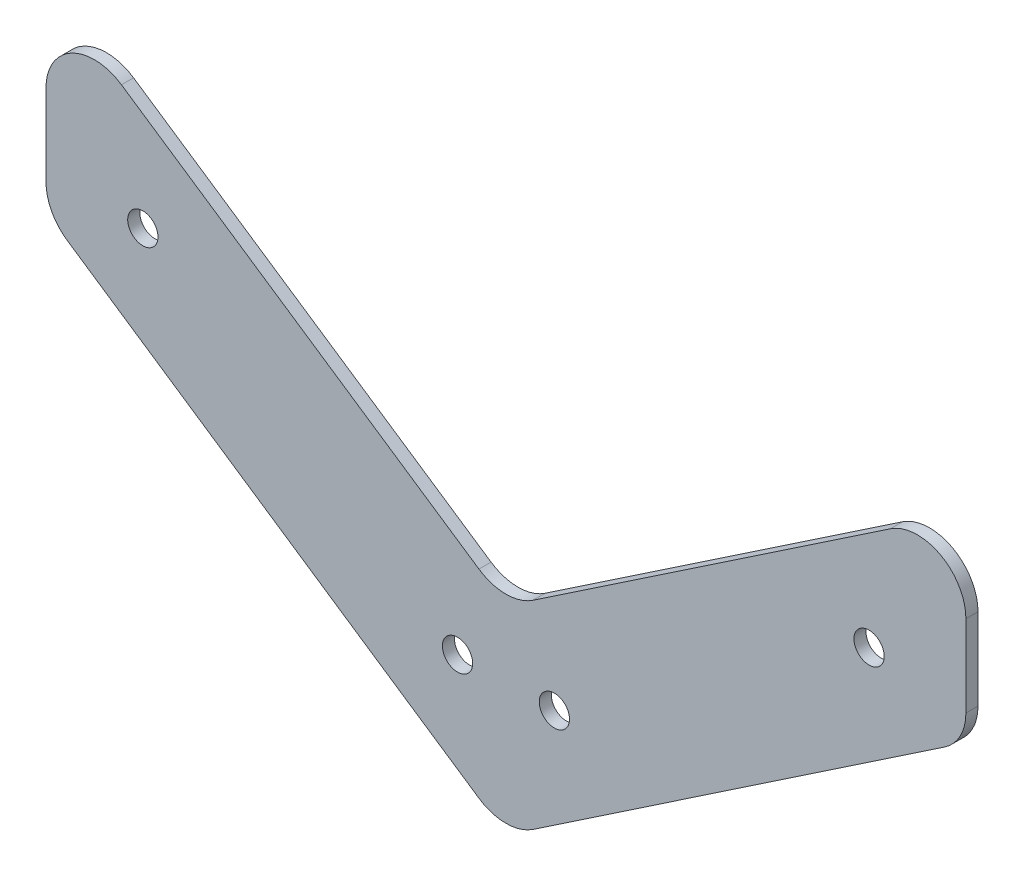
ISO-10303-21;
HEADER;
FILE_DESCRIPTION(('STEP AP214'),'2;1');
FILE_NAME('part.step','',(''),(''),'','','');
FILE_SCHEMA(('AUTOMOTIVE_DESIGN { 1 0 10303 214 1 1 1 1 }'));
ENDSEC;
DATA;
#1=APPLICATION_CONTEXT('core data for automotive mechanical design processes');
#2=APPLICATION_PROTOCOL_DEFINITION('international standard','automotive_design',2000,#1);
#3=PRODUCT_CONTEXT('',#1,'mechanical');
#4=PRODUCT('Part','Part','',(#3));
#5=PRODUCT_RELATED_PRODUCT_CATEGORY('part','',(#4));
#6=PRODUCT_DEFINITION_FORMATION('','',#4);
#7=PRODUCT_DEFINITION_CONTEXT('part definition',#1,'design');
#8=PRODUCT_DEFINITION('design','',#6,#7);
#9=PRODUCT_DEFINITION_SHAPE('','',#8);
#10=(LENGTH_UNIT() NAMED_UNIT(*) SI_UNIT(.MILLI.,.METRE.));
#11=(NAMED_UNIT(*) PLANE_ANGLE_UNIT() SI_UNIT($,.RADIAN.));
#12=(NAMED_UNIT(*) SI_UNIT($,.STERADIAN.) SOLID_ANGLE_UNIT());
#13=UNCERTAINTY_MEASURE_WITH_UNIT(LENGTH_MEASURE(1.E-05),#10,'distance_accuracy_value','');
#14=(GEOMETRIC_REPRESENTATION_CONTEXT(3) GLOBAL_UNCERTAINTY_ASSIGNED_CONTEXT((#13)) GLOBAL_UNIT_ASSIGNED_CONTEXT((#10,
#11,#12)) REPRESENTATION_CONTEXT('',''));
#15=CARTESIAN_POINT('',(0.,0.,0.));
#16=DIRECTION('',(0.,0.,1.));
#17=DIRECTION('',(1.,0.,0.));
#18=AXIS2_PLACEMENT_3D('',#15,#16,#17);
#19=CARTESIAN_POINT('',(0.,0.,3.175));
#20=DIRECTION('',(0.,0.,1.));
#21=DIRECTION('',(1.,0.,0.));
#22=AXIS2_PLACEMENT_3D('',#19,#20,#21);
#23=PLANE('',#22);
#24=CARTESIAN_POINT('',(-12.7,-17.4767862240514,3.175));
#25=DIRECTION('',(0.,0.,1.));
#26=DIRECTION('',(1.,0.,0.));
#27=AXIS2_PLACEMENT_3D('',#24,#25,#26);
#28=CIRCLE('',#27,3.96875);
#29=CARTESIAN_POINT('',(-8.73125,-17.4767862240514,3.175));
#30=VERTEX_POINT('',#29);
#31=EDGE_CURVE('E440',#30,#30,#28,.T.);
#32=ORIENTED_EDGE('',*,*,#31,.F.);
#33=EDGE_LOOP('',(#32));
#34=FACE_BOUND('',#33,.T.);
#35=CARTESIAN_POINT('',(-95.25,38.1,3.175));
#36=DIRECTION('',(0.,0.,1.));
#37=DIRECTION('',(1.,0.,0.));
#38=AXIS2_PLACEMENT_3D('',#35,#36,#37);
#39=CIRCLE('',#38,3.96874999999999);
#40=CARTESIAN_POINT('',(-91.28125,38.1,3.175));
#41=VERTEX_POINT('',#40);
#42=EDGE_CURVE('E230',#41,#41,#39,.T.);
#43=ORIENTED_EDGE('',*,*,#42,.F.);
#44=EDGE_LOOP('',(#43));
#45=FACE_BOUND('',#44,.T.);
#46=DIRECTION('',(0.829521242409178,-0.558475163630338,0.));
#47=VECTOR('',#46,1.);
#48=CARTESIAN_POINT('',(0.,-52.0541220555032,3.175));
#49=LINE('',#48,#47);
#50=CARTESIAN_POINT('',(-115.042634578105,25.3983298960295,3.175));
#51=VERTEX_POINT('',#50);
#52=CARTESIAN_POINT('',(-7.0926345781053,-47.2790059354223,3.175));
#53=VERTEX_POINT('',#52);
#54=EDGE_CURVE('E246',#51,#53,#49,.T.);
#55=ORIENTED_EDGE('',*,*,#54,.T.);
#56=CARTESIAN_POINT('',(0.,-36.7440861568258,3.175));
#57=DIRECTION('',(0.,0.,1.));
#58=DIRECTION('',(1.,0.,0.));
#59=AXIS2_PLACEMENT_3D('',#56,#57,#58);
#60=CIRCLE('',#59,12.7);
#61=CARTESIAN_POINT('',(7.09263457810531,-47.2790059354223,3.175));
#62=VERTEX_POINT('',#61);
#63=EDGE_CURVE('E192',#53,#62,#60,.T.);
#64=ORIENTED_EDGE('',*,*,#63,.T.);
#65=DIRECTION('',(0.829521242409178,0.558475163630338,0.));
#66=VECTOR('',#65,1.);
#67=CARTESIAN_POINT('',(120.65,29.1734885796488,3.175));
#68=LINE('',#67,#66);
#69=CARTESIAN_POINT('',(115.042634578105,25.3983298960294,3.175));
#70=VERTEX_POINT('',#69);
#71=EDGE_CURVE('E151',#62,#70,#68,.T.);
#72=ORIENTED_EDGE('',*,*,#71,.T.);
#73=CARTESIAN_POINT('',(107.95,35.933249674626,3.175));
#74=DIRECTION('',(0.,0.,1.));
#75=DIRECTION('',(1.,0.,0.));
#76=AXIS2_PLACEMENT_3D('',#73,#74,#75);
#77=CIRCLE('',#76,12.7);
#78=CARTESIAN_POINT('',(120.65,35.933249674626,3.175));
#79=VERTEX_POINT('',#78);
#80=EDGE_CURVE('E62',#70,#79,#77,.T.);
#81=ORIENTED_EDGE('',*,*,#80,.T.);
#82=DIRECTION('',(0.,1.,0.));
#83=VECTOR('',#82,1.);
#84=CARTESIAN_POINT('',(120.65,81.227610635152,3.175));
#85=LINE('',#84,#83);
#86=CARTESIAN_POINT('',(120.65,57.3672999327744,3.175));
#87=VERTEX_POINT('',#86);
#88=EDGE_CURVE('E170',#79,#87,#85,.T.);
#89=ORIENTED_EDGE('',*,*,#88,.T.);
#90=CARTESIAN_POINT('',(107.95,57.3672999327744,3.175));
#91=DIRECTION('',(0.,0.,1.));
#92=DIRECTION('',(1.,0.,0.));
#93=AXIS2_PLACEMENT_3D('',#90,#91,#92);
#94=CIRCLE('',#93,12.7);
#95=CARTESIAN_POINT('',(100.857365421895,67.9022197113709,3.175));
#96=VERTEX_POINT('',#95);
#97=EDGE_CURVE('E187',#87,#96,#94,.T.);
#98=ORIENTED_EDGE('',*,*,#97,.T.);
#99=DIRECTION('',(-0.829521242409178,-0.558475163630338,0.));
#100=VECTOR('',#99,1.);
#101=CARTESIAN_POINT('',(0.,0.,3.175));
#102=LINE('',#101,#100);
#103=CARTESIAN_POINT('',(7.09263457810529,4.77511612008083,3.175));
#104=VERTEX_POINT('',#103);
#105=EDGE_CURVE('E164',#96,#104,#102,.T.);
#106=ORIENTED_EDGE('',*,*,#105,.T.);
#107=CARTESIAN_POINT('',(0.,15.3100358986774,3.175));
#108=DIRECTION('',(0.,0.,1.));
#109=DIRECTION('',(1.,0.,0.));
#110=AXIS2_PLACEMENT_3D('',#107,#108,#109);
#111=CIRCLE('',#110,12.7);
#112=CARTESIAN_POINT('',(-7.09263457810529,4.77511612008083,3.175));
#113=VERTEX_POINT('',#112);
#114=EDGE_CURVE('E11',#104,#113,#111,.F.);
#115=ORIENTED_EDGE('',*,*,#114,.T.);
#116=DIRECTION('',(-0.829521242409178,0.558475163630338,0.));
#117=VECTOR('',#116,1.);
#118=CARTESIAN_POINT('',(0.,0.,3.175));
#119=LINE('',#118,#117);
#120=CARTESIAN_POINT('',(-100.857365421895,67.9022197113709,3.175));
#121=VERTEX_POINT('',#120);
#122=EDGE_CURVE('E238',#113,#121,#119,.T.);
#123=ORIENTED_EDGE('',*,*,#122,.T.);
#124=CARTESIAN_POINT('',(-107.95,57.3672999327744,3.175));
#125=DIRECTION('',(0.,0.,1.));
#126=DIRECTION('',(1.,0.,0.));
#127=AXIS2_PLACEMENT_3D('',#124,#125,#126);
#128=CIRCLE('',#127,12.7);
#129=CARTESIAN_POINT('',(-120.65,57.3672999327744,3.175));
#130=VERTEX_POINT('',#129);
#131=EDGE_CURVE('E183',#121,#130,#128,.T.);
#132=ORIENTED_EDGE('',*,*,#131,.T.);
#133=DIRECTION('',(0.,-1.,0.));
#134=VECTOR('',#133,1.);
#135=CARTESIAN_POINT('',(-120.65,29.1734885796488,3.175));
#136=LINE('',#135,#134);
#137=CARTESIAN_POINT('',(-120.65,35.933249674626,3.175));
#138=VERTEX_POINT('',#137);
#139=EDGE_CURVE('E243',#130,#138,#136,.T.);
#140=ORIENTED_EDGE('',*,*,#139,.T.);
#141=CARTESIAN_POINT('',(-107.95,35.933249674626,3.175));
#142=DIRECTION('',(0.,0.,1.));
#143=DIRECTION('',(1.,0.,0.));
#144=AXIS2_PLACEMENT_3D('',#141,#142,#143);
#145=CIRCLE('',#144,12.7);
#146=EDGE_CURVE('E185',#138,#51,#145,.T.);
#147=ORIENTED_EDGE('',*,*,#146,.T.);
#148=EDGE_LOOP('',(#55,#64,#72,#81,#89,#98,#106,#115,#123,#132,#140,#147));
#149=FACE_BOUND('',#148,.T.);
#150=CARTESIAN_POINT('',(95.25,38.1,3.175));
#151=DIRECTION('',(0.,0.,1.));
#152=DIRECTION('',(1.,0.,0.));
#153=AXIS2_PLACEMENT_3D('',#150,#151,#152);
#154=CIRCLE('',#153,3.96874999999999);
#155=CARTESIAN_POINT('',(99.21875,38.1,3.175));
#156=VERTEX_POINT('',#155);
#157=EDGE_CURVE('E434',#156,#156,#154,.T.);
#158=ORIENTED_EDGE('',*,*,#157,.F.);
#159=EDGE_LOOP('',(#158));
#160=FACE_BOUND('',#159,.T.);
#161=CARTESIAN_POINT('',(12.7,-17.4767862240514,3.175));
#162=DIRECTION('',(0.,0.,1.));
#163=DIRECTION('',(1.,0.,0.));
#164=AXIS2_PLACEMENT_3D('',#161,#162,#163);
#165=CIRCLE('',#164,3.96875);
#166=CARTESIAN_POINT('',(16.66875,-17.4767862240514,3.175));
#167=VERTEX_POINT('',#166);
#168=EDGE_CURVE('E462',#167,#167,#165,.T.);
#169=ORIENTED_EDGE('',*,*,#168,.F.);
#170=EDGE_LOOP('',(#169));
#171=FACE_BOUND('',#170,.T.);
#172=ADVANCED_FACE('F36',(#34,#45,#149,#160,#171),#23,.T.);
#173=CARTESIAN_POINT('',(0.,0.,0.));
#174=DIRECTION('',(0.,0.,1.));
#175=DIRECTION('',(1.,0.,0.));
#176=AXIS2_PLACEMENT_3D('',#173,#174,#175);
#177=PLANE('',#176);
#178=DIRECTION('',(0.829521242409178,0.558475163630338,0.));
#179=VECTOR('',#178,1.);
#180=CARTESIAN_POINT('',(120.65,29.1734885796488,0.));
#181=LINE('',#180,#179);
#182=CARTESIAN_POINT('',(7.09263457810531,-47.2790059354223,0.));
#183=VERTEX_POINT('',#182);
#184=CARTESIAN_POINT('',(115.042634578105,25.3983298960294,0.));
#185=VERTEX_POINT('',#184);
#186=EDGE_CURVE('E149',#183,#185,#181,.T.);
#187=ORIENTED_EDGE('',*,*,#186,.F.);
#188=CARTESIAN_POINT('',(0.,-36.7440861568258,0.));
#189=DIRECTION('',(0.,0.,1.));
#190=DIRECTION('',(1.,0.,0.));
#191=AXIS2_PLACEMENT_3D('',#188,#189,#190);
#192=CIRCLE('',#191,12.7);
#193=CARTESIAN_POINT('',(-7.0926345781053,-47.2790059354223,0.));
#194=VERTEX_POINT('',#193);
#195=EDGE_CURVE('E132',#183,#194,#192,.F.);
#196=ORIENTED_EDGE('',*,*,#195,.T.);
#197=DIRECTION('',(0.829521242409178,-0.558475163630338,0.));
#198=VECTOR('',#197,1.);
#199=CARTESIAN_POINT('',(0.,-52.0541220555032,0.));
#200=LINE('',#199,#198);
#201=CARTESIAN_POINT('',(-115.042634578105,25.3983298960295,0.));
#202=VERTEX_POINT('',#201);
#203=EDGE_CURVE('E160',#202,#194,#200,.T.);
#204=ORIENTED_EDGE('',*,*,#203,.F.);
#205=CARTESIAN_POINT('',(-107.95,35.933249674626,0.));
#206=DIRECTION('',(0.,0.,1.));
#207=DIRECTION('',(1.,0.,0.));
#208=AXIS2_PLACEMENT_3D('',#205,#206,#207);
#209=CIRCLE('',#208,12.7);
#210=CARTESIAN_POINT('',(-120.65,35.933249674626,0.));
#211=VERTEX_POINT('',#210);
#212=EDGE_CURVE('E173',#202,#211,#209,.F.);
#213=ORIENTED_EDGE('',*,*,#212,.T.);
#214=DIRECTION('',(0.,-1.,0.));
#215=VECTOR('',#214,1.);
#216=CARTESIAN_POINT('',(-120.65,29.1734885796488,0.));
#217=LINE('',#216,#215);
#218=CARTESIAN_POINT('',(-120.65,57.3672999327744,0.));
#219=VERTEX_POINT('',#218);
#220=EDGE_CURVE('E166',#219,#211,#217,.T.);
#221=ORIENTED_EDGE('',*,*,#220,.F.);
#222=CARTESIAN_POINT('',(-107.95,57.3672999327744,0.));
#223=DIRECTION('',(0.,0.,1.));
#224=DIRECTION('',(1.,0.,0.));
#225=AXIS2_PLACEMENT_3D('',#222,#223,#224);
#226=CIRCLE('',#225,12.7);
#227=CARTESIAN_POINT('',(-100.857365421895,67.9022197113709,0.));
#228=VERTEX_POINT('',#227);
#229=EDGE_CURVE('E152',#219,#228,#226,.F.);
#230=ORIENTED_EDGE('',*,*,#229,.T.);
#231=DIRECTION('',(-0.829521242409178,0.558475163630338,0.));
#232=VECTOR('',#231,1.);
#233=CARTESIAN_POINT('',(0.,0.,0.));
#234=LINE('',#233,#232);
#235=CARTESIAN_POINT('',(-7.09263457810529,4.77511612008083,0.));
#236=VERTEX_POINT('',#235);
#237=EDGE_CURVE('E220',#236,#228,#234,.T.);
#238=ORIENTED_EDGE('',*,*,#237,.F.);
#239=CARTESIAN_POINT('',(0.,15.3100358986774,0.));
#240=DIRECTION('',(0.,0.,1.));
#241=DIRECTION('',(1.,0.,0.));
#242=AXIS2_PLACEMENT_3D('',#239,#240,#241);
#243=CIRCLE('',#242,12.7);
#244=CARTESIAN_POINT('',(7.09263457810529,4.77511612008083,0.));
#245=VERTEX_POINT('',#244);
#246=EDGE_CURVE('E44',#236,#245,#243,.T.);
#247=ORIENTED_EDGE('',*,*,#246,.T.);
#248=DIRECTION('',(-0.829521242409178,-0.558475163630338,0.));
#249=VECTOR('',#248,1.);
#250=CARTESIAN_POINT('',(0.,0.,0.));
#251=LINE('',#250,#249);
#252=CARTESIAN_POINT('',(100.857365421895,67.9022197113709,0.));
#253=VERTEX_POINT('',#252);
#254=EDGE_CURVE('E218',#253,#245,#251,.T.);
#255=ORIENTED_EDGE('',*,*,#254,.F.);
#256=CARTESIAN_POINT('',(107.95,57.3672999327744,0.));
#257=DIRECTION('',(0.,0.,1.));
#258=DIRECTION('',(1.,0.,0.));
#259=AXIS2_PLACEMENT_3D('',#256,#257,#258);
#260=CIRCLE('',#259,12.7);
#261=CARTESIAN_POINT('',(120.65,57.3672999327744,0.));
#262=VERTEX_POINT('',#261);
#263=EDGE_CURVE('E175',#253,#262,#260,.F.);
#264=ORIENTED_EDGE('',*,*,#263,.T.);
#265=DIRECTION('',(0.,1.,0.));
#266=VECTOR('',#265,1.);
#267=CARTESIAN_POINT('',(120.65,81.227610635152,0.));
#268=LINE('',#267,#266);
#269=CARTESIAN_POINT('',(120.65,35.933249674626,0.));
#270=VERTEX_POINT('',#269);
#271=EDGE_CURVE('E159',#270,#262,#268,.T.);
#272=ORIENTED_EDGE('',*,*,#271,.F.);
#273=CARTESIAN_POINT('',(107.95,35.933249674626,0.));
#274=DIRECTION('',(0.,0.,1.));
#275=DIRECTION('',(1.,0.,0.));
#276=AXIS2_PLACEMENT_3D('',#273,#274,#275);
#277=CIRCLE('',#276,12.7);
#278=EDGE_CURVE('E143',#270,#185,#277,.F.);
#279=ORIENTED_EDGE('',*,*,#278,.T.);
#280=EDGE_LOOP('',(#187,#196,#204,#213,#221,#230,#238,#247,#255,#264,#272,#279));
#281=FACE_BOUND('',#280,.T.);
#282=CARTESIAN_POINT('',(-95.25,38.1,0.));
#283=DIRECTION('',(0.,0.,1.));
#284=DIRECTION('',(1.,0.,0.));
#285=AXIS2_PLACEMENT_3D('',#282,#283,#284);
#286=CIRCLE('',#285,3.96874999999999);
#287=CARTESIAN_POINT('',(-91.28125,38.1,0.));
#288=VERTEX_POINT('',#287);
#289=EDGE_CURVE('E443',#288,#288,#286,.T.);
#290=ORIENTED_EDGE('',*,*,#289,.T.);
#291=EDGE_LOOP('',(#290));
#292=FACE_BOUND('',#291,.T.);
#293=CARTESIAN_POINT('',(95.25,38.1,0.));
#294=DIRECTION('',(0.,0.,1.));
#295=DIRECTION('',(1.,0.,0.));
#296=AXIS2_PLACEMENT_3D('',#293,#294,#295);
#297=CIRCLE('',#296,3.96874999999999);
#298=CARTESIAN_POINT('',(99.21875,38.1,0.));
#299=VERTEX_POINT('',#298);
#300=EDGE_CURVE('E437',#299,#299,#297,.T.);
#301=ORIENTED_EDGE('',*,*,#300,.T.);
#302=EDGE_LOOP('',(#301));
#303=FACE_BOUND('',#302,.T.);
#304=CARTESIAN_POINT('',(-12.7,-17.4767862240514,0.));
#305=DIRECTION('',(0.,0.,1.));
#306=DIRECTION('',(1.,0.,0.));
#307=AXIS2_PLACEMENT_3D('',#304,#305,#306);
#308=CIRCLE('',#307,3.96875);
#309=CARTESIAN_POINT('',(-8.73125,-17.4767862240514,0.));
#310=VERTEX_POINT('',#309);
#311=EDGE_CURVE('E446',#310,#310,#308,.T.);
#312=ORIENTED_EDGE('',*,*,#311,.T.);
#313=EDGE_LOOP('',(#312));
#314=FACE_BOUND('',#313,.T.);
#315=CARTESIAN_POINT('',(12.7,-17.4767862240514,0.));
#316=DIRECTION('',(0.,0.,1.));
#317=DIRECTION('',(1.,0.,0.));
#318=AXIS2_PLACEMENT_3D('',#315,#316,#317);
#319=CIRCLE('',#318,3.96875);
#320=CARTESIAN_POINT('',(16.66875,-17.4767862240514,0.));
#321=VERTEX_POINT('',#320);
#322=EDGE_CURVE('E460',#321,#321,#319,.T.);
#323=ORIENTED_EDGE('',*,*,#322,.T.);
#324=EDGE_LOOP('',(#323));
#325=FACE_BOUND('',#324,.T.);
#326=ADVANCED_FACE('F155',(#281,#292,#303,#314,#325),#177,.F.);
#327=CARTESIAN_POINT('',(0.,0.,3.175));
#328=DIRECTION('',(0.558475163630338,-0.829521242409178,0.));
#329=DIRECTION('',(0.829521242409179,0.558475163630338,0.));
#330=AXIS2_PLACEMENT_3D('',#327,#328,#329);
#331=PLANE('',#330);
#332=ORIENTED_EDGE('',*,*,#254,.T.);
#333=DIRECTION('',(0.,0.,-1.));
#334=VECTOR('',#333,1.);
#335=CARTESIAN_POINT('',(7.09263457810529,4.77511612008083,3.175));
#336=LINE('',#335,#334);
#337=EDGE_CURVE('E203',#245,#104,#336,.F.);
#338=ORIENTED_EDGE('',*,*,#337,.T.);
#339=ORIENTED_EDGE('',*,*,#105,.F.);
#340=DIRECTION('',(0.,0.,-1.));
#341=VECTOR('',#340,1.);
#342=CARTESIAN_POINT('',(100.857365421895,67.9022197113709,3.175));
#343=LINE('',#342,#341);
#344=EDGE_CURVE('E199',#96,#253,#343,.T.);
#345=ORIENTED_EDGE('',*,*,#344,.T.);
#346=EDGE_LOOP('',(#332,#338,#339,#345));
#347=FACE_BOUND('',#346,.T.);
#348=ADVANCED_FACE('F225',(#347),#331,.F.);
#349=CARTESIAN_POINT('',(0.,0.,3.175));
#350=DIRECTION('',(-0.558475163630338,-0.829521242409178,0.));
#351=DIRECTION('',(0.829521242409179,-0.558475163630338,0.));
#352=AXIS2_PLACEMENT_3D('',#349,#350,#351);
#353=PLANE('',#352);
#354=ORIENTED_EDGE('',*,*,#122,.F.);
#355=DIRECTION('',(0.,0.,-1.));
#356=VECTOR('',#355,1.);
#357=CARTESIAN_POINT('',(-7.09263457810529,4.77511612008083,0.));
#358=LINE('',#357,#356);
#359=EDGE_CURVE('E196',#113,#236,#358,.T.);
#360=ORIENTED_EDGE('',*,*,#359,.T.);
#361=ORIENTED_EDGE('',*,*,#237,.T.);
#362=DIRECTION('',(0.,0.,-1.));
#363=VECTOR('',#362,1.);
#364=CARTESIAN_POINT('',(-100.857365421895,67.902219711371,3.175));
#365=LINE('',#364,#363);
#366=EDGE_CURVE('E194',#228,#121,#365,.F.);
#367=ORIENTED_EDGE('',*,*,#366,.T.);
#368=EDGE_LOOP('',(#354,#360,#361,#367));
#369=FACE_BOUND('',#368,.T.);
#370=ADVANCED_FACE('F241',(#369),#353,.F.);
#371=CARTESIAN_POINT('',(-120.65,29.1734885796488,3.175));
#372=DIRECTION('',(1.,0.,0.));
#373=DIRECTION('',(0.,0.,-1.));
#374=AXIS2_PLACEMENT_3D('',#371,#372,#373);
#375=PLANE('',#374);
#376=ORIENTED_EDGE('',*,*,#220,.T.);
#377=DIRECTION('',(0.,0.,-1.));
#378=VECTOR('',#377,1.);
#379=CARTESIAN_POINT('',(-120.65,35.933249674626,3.175));
#380=LINE('',#379,#378);
#381=EDGE_CURVE('E214',#211,#138,#380,.F.);
#382=ORIENTED_EDGE('',*,*,#381,.T.);
#383=ORIENTED_EDGE('',*,*,#139,.F.);
#384=DIRECTION('',(0.,0.,-1.));
#385=VECTOR('',#384,1.);
#386=CARTESIAN_POINT('',(-120.65,57.3672999327744,3.175));
#387=LINE('',#386,#385);
#388=EDGE_CURVE('E211',#130,#219,#387,.T.);
#389=ORIENTED_EDGE('',*,*,#388,.T.);
#390=EDGE_LOOP('',(#376,#382,#383,#389));
#391=FACE_BOUND('',#390,.T.);
#392=ADVANCED_FACE('F260',(#391),#375,.F.);
#393=CARTESIAN_POINT('',(0.,-52.0541220555032,3.175));
#394=DIRECTION('',(0.558475163630338,0.829521242409178,0.));
#395=DIRECTION('',(-0.829521242409178,0.558475163630338,0.));
#396=AXIS2_PLACEMENT_3D('',#393,#394,#395);
#397=PLANE('',#396);
#398=ORIENTED_EDGE('',*,*,#203,.T.);
#399=DIRECTION('',(0.,0.,-1.));
#400=VECTOR('',#399,1.);
#401=CARTESIAN_POINT('',(-7.0926345781053,-47.2790059354223,3.175));
#402=LINE('',#401,#400);
#403=EDGE_CURVE('E137',#194,#53,#402,.F.);
#404=ORIENTED_EDGE('',*,*,#403,.T.);
#405=ORIENTED_EDGE('',*,*,#54,.F.);
#406=DIRECTION('',(0.,0.,-1.));
#407=VECTOR('',#406,1.);
#408=CARTESIAN_POINT('',(-115.042634578105,25.3983298960295,3.175));
#409=LINE('',#408,#407);
#410=EDGE_CURVE('E142',#51,#202,#409,.T.);
#411=ORIENTED_EDGE('',*,*,#410,.T.);
#412=EDGE_LOOP('',(#398,#404,#405,#411));
#413=FACE_BOUND('',#412,.T.);
#414=ADVANCED_FACE('F269',(#413),#397,.F.);
#415=CARTESIAN_POINT('',(120.65,29.1734885796488,3.175));
#416=DIRECTION('',(-0.558475163630338,0.829521242409178,0.));
#417=DIRECTION('',(-0.829521242409179,-0.558475163630338,0.));
#418=AXIS2_PLACEMENT_3D('',#415,#416,#417);
#419=PLANE('',#418);
#420=ORIENTED_EDGE('',*,*,#71,.F.);
#421=DIRECTION('',(0.,0.,-1.));
#422=VECTOR('',#421,1.);
#423=CARTESIAN_POINT('',(7.09263457810529,-47.2790059354223,3.175));
#424=LINE('',#423,#422);
#425=EDGE_CURVE('E136',#62,#183,#424,.T.);
#426=ORIENTED_EDGE('',*,*,#425,.T.);
#427=ORIENTED_EDGE('',*,*,#186,.T.);
#428=DIRECTION('',(0.,0.,-1.));
#429=VECTOR('',#428,1.);
#430=CARTESIAN_POINT('',(115.042634578105,25.3983298960294,3.175));
#431=LINE('',#430,#429);
#432=EDGE_CURVE('E153',#185,#70,#431,.F.);
#433=ORIENTED_EDGE('',*,*,#432,.T.);
#434=EDGE_LOOP('',(#420,#426,#427,#433));
#435=FACE_BOUND('',#434,.T.);
#436=ADVANCED_FACE('F148',(#435),#419,.F.);
#437=CARTESIAN_POINT('',(120.65,81.227610635152,3.175));
#438=DIRECTION('',(-1.,0.,0.));
#439=DIRECTION('',(0.,0.,1.));
#440=AXIS2_PLACEMENT_3D('',#437,#438,#439);
#441=PLANE('',#440);
#442=ORIENTED_EDGE('',*,*,#88,.F.);
#443=DIRECTION('',(0.,0.,-1.));
#444=VECTOR('',#443,1.);
#445=CARTESIAN_POINT('',(120.65,35.933249674626,3.175));
#446=LINE('',#445,#444);
#447=EDGE_CURVE('E207',#79,#270,#446,.T.);
#448=ORIENTED_EDGE('',*,*,#447,.T.);
#449=ORIENTED_EDGE('',*,*,#271,.T.);
#450=DIRECTION('',(0.,0.,-1.));
#451=VECTOR('',#450,1.);
#452=CARTESIAN_POINT('',(120.65,57.3672999327744,3.175));
#453=LINE('',#452,#451);
#454=EDGE_CURVE('E54',#262,#87,#453,.F.);
#455=ORIENTED_EDGE('',*,*,#454,.T.);
#456=EDGE_LOOP('',(#442,#448,#449,#455));
#457=FACE_BOUND('',#456,.T.);
#458=ADVANCED_FACE('F276',(#457),#441,.F.);
#459=CARTESIAN_POINT('',(-95.25,38.1,3.175));
#460=DIRECTION('',(0.,0.,-1.));
#461=DIRECTION('',(-1.,0.,0.));
#462=AXIS2_PLACEMENT_3D('',#459,#460,#461);
#463=CYLINDRICAL_SURFACE('',#462,3.96874999999999);
#464=ORIENTED_EDGE('',*,*,#42,.T.);
#465=EDGE_LOOP('',(#464));
#466=FACE_BOUND('',#465,.T.);
#467=ORIENTED_EDGE('',*,*,#289,.F.);
#468=EDGE_LOOP('',(#467));
#469=FACE_BOUND('',#468,.T.);
#470=ADVANCED_FACE('F289',(#466,#469),#463,.F.);
#471=CARTESIAN_POINT('',(95.25,38.1,3.175));
#472=DIRECTION('',(0.,0.,-1.));
#473=DIRECTION('',(-1.,0.,0.));
#474=AXIS2_PLACEMENT_3D('',#471,#472,#473);
#475=CYLINDRICAL_SURFACE('',#474,3.96874999999999);
#476=ORIENTED_EDGE('',*,*,#157,.T.);
#477=EDGE_LOOP('',(#476));
#478=FACE_BOUND('',#477,.T.);
#479=ORIENTED_EDGE('',*,*,#300,.F.);
#480=EDGE_LOOP('',(#479));
#481=FACE_BOUND('',#480,.T.);
#482=ADVANCED_FACE('F296',(#478,#481),#475,.F.);
#483=CARTESIAN_POINT('',(-12.7,-17.4767862240514,3.175));
#484=DIRECTION('',(0.,0.,-1.));
#485=DIRECTION('',(-1.,0.,0.));
#486=AXIS2_PLACEMENT_3D('',#483,#484,#485);
#487=CYLINDRICAL_SURFACE('',#486,3.96875);
#488=ORIENTED_EDGE('',*,*,#31,.T.);
#489=EDGE_LOOP('',(#488));
#490=FACE_BOUND('',#489,.T.);
#491=ORIENTED_EDGE('',*,*,#311,.F.);
#492=EDGE_LOOP('',(#491));
#493=FACE_BOUND('',#492,.T.);
#494=ADVANCED_FACE('F404',(#490,#493),#487,.F.);
#495=CARTESIAN_POINT('',(12.7,-17.4767862240514,3.175));
#496=DIRECTION('',(0.,0.,-1.));
#497=DIRECTION('',(-1.,0.,0.));
#498=AXIS2_PLACEMENT_3D('',#495,#496,#497);
#499=CYLINDRICAL_SURFACE('',#498,3.96875);
#500=ORIENTED_EDGE('',*,*,#168,.T.);
#501=EDGE_LOOP('',(#500));
#502=FACE_BOUND('',#501,.T.);
#503=ORIENTED_EDGE('',*,*,#322,.F.);
#504=EDGE_LOOP('',(#503));
#505=FACE_BOUND('',#504,.T.);
#506=ADVANCED_FACE('F348',(#502,#505),#499,.F.);
#507=CARTESIAN_POINT('',(0.,-36.7440861568258,3.175));
#508=DIRECTION('',(0.,0.,-1.));
#509=DIRECTION('',(-1.,0.,0.));
#510=AXIS2_PLACEMENT_3D('',#507,#508,#509);
#511=CYLINDRICAL_SURFACE('',#510,12.7);
#512=ORIENTED_EDGE('',*,*,#63,.F.);
#513=ORIENTED_EDGE('',*,*,#403,.F.);
#514=ORIENTED_EDGE('',*,*,#195,.F.);
#515=ORIENTED_EDGE('',*,*,#425,.F.);
#516=EDGE_LOOP('',(#512,#513,#514,#515));
#517=FACE_BOUND('',#516,.T.);
#518=ADVANCED_FACE('F135',(#517),#511,.T.);
#519=CARTESIAN_POINT('',(0.,15.3100358986774,3.175));
#520=DIRECTION('',(0.,0.,1.));
#521=DIRECTION('',(1.,0.,0.));
#522=AXIS2_PLACEMENT_3D('',#519,#520,#521);
#523=CYLINDRICAL_SURFACE('',#522,12.7);
#524=ORIENTED_EDGE('',*,*,#114,.F.);
#525=ORIENTED_EDGE('',*,*,#337,.F.);
#526=ORIENTED_EDGE('',*,*,#246,.F.);
#527=ORIENTED_EDGE('',*,*,#359,.F.);
#528=EDGE_LOOP('',(#524,#525,#526,#527));
#529=FACE_BOUND('',#528,.T.);
#530=ADVANCED_FACE('F233',(#529),#523,.F.);
#531=CARTESIAN_POINT('',(107.95,35.933249674626,3.175));
#532=DIRECTION('',(0.,0.,-1.));
#533=DIRECTION('',(-1.,0.,0.));
#534=AXIS2_PLACEMENT_3D('',#531,#532,#533);
#535=CYLINDRICAL_SURFACE('',#534,12.7);
#536=ORIENTED_EDGE('',*,*,#80,.F.);
#537=ORIENTED_EDGE('',*,*,#432,.F.);
#538=ORIENTED_EDGE('',*,*,#278,.F.);
#539=ORIENTED_EDGE('',*,*,#447,.F.);
#540=EDGE_LOOP('',(#536,#537,#538,#539));
#541=FACE_BOUND('',#540,.T.);
#542=ADVANCED_FACE('F301',(#541),#535,.T.);
#543=CARTESIAN_POINT('',(107.95,57.3672999327744,3.175));
#544=DIRECTION('',(0.,0.,-1.));
#545=DIRECTION('',(-1.,0.,0.));
#546=AXIS2_PLACEMENT_3D('',#543,#544,#545);
#547=CYLINDRICAL_SURFACE('',#546,12.7);
#548=ORIENTED_EDGE('',*,*,#97,.F.);
#549=ORIENTED_EDGE('',*,*,#454,.F.);
#550=ORIENTED_EDGE('',*,*,#263,.F.);
#551=ORIENTED_EDGE('',*,*,#344,.F.);
#552=EDGE_LOOP('',(#548,#549,#550,#551));
#553=FACE_BOUND('',#552,.T.);
#554=ADVANCED_FACE('F303',(#553),#547,.T.);
#555=CARTESIAN_POINT('',(-107.95,35.933249674626,3.175));
#556=DIRECTION('',(0.,0.,-1.));
#557=DIRECTION('',(-1.,0.,0.));
#558=AXIS2_PLACEMENT_3D('',#555,#556,#557);
#559=CYLINDRICAL_SURFACE('',#558,12.7);
#560=ORIENTED_EDGE('',*,*,#146,.F.);
#561=ORIENTED_EDGE('',*,*,#381,.F.);
#562=ORIENTED_EDGE('',*,*,#212,.F.);
#563=ORIENTED_EDGE('',*,*,#410,.F.);
#564=EDGE_LOOP('',(#560,#561,#562,#563));
#565=FACE_BOUND('',#564,.T.);
#566=ADVANCED_FACE('F265',(#565),#559,.T.);
#567=CARTESIAN_POINT('',(-107.95,57.3672999327744,3.175));
#568=DIRECTION('',(0.,0.,-1.));
#569=DIRECTION('',(-1.,0.,0.));
#570=AXIS2_PLACEMENT_3D('',#567,#568,#569);
#571=CYLINDRICAL_SURFACE('',#570,12.7);
#572=ORIENTED_EDGE('',*,*,#131,.F.);
#573=ORIENTED_EDGE('',*,*,#366,.F.);
#574=ORIENTED_EDGE('',*,*,#229,.F.);
#575=ORIENTED_EDGE('',*,*,#388,.F.);
#576=EDGE_LOOP('',(#572,#573,#574,#575));
#577=FACE_BOUND('',#576,.T.);
#578=ADVANCED_FACE('F38',(#577),#571,.T.);
#579=CLOSED_SHELL('',(#172,#326,#348,#370,#392,#414,#436,#458,#470,#482,#494,#506,#518,#530,
#542,#554,#566,#578));
#580=MANIFOLD_SOLID_BREP('B2',#579);
#581=ADVANCED_BREP_SHAPE_REPRESENTATION('',(#18,#580),#14);
#582=SHAPE_DEFINITION_REPRESENTATION(#9,#581);
ENDSEC;
END-ISO-10303-21;
